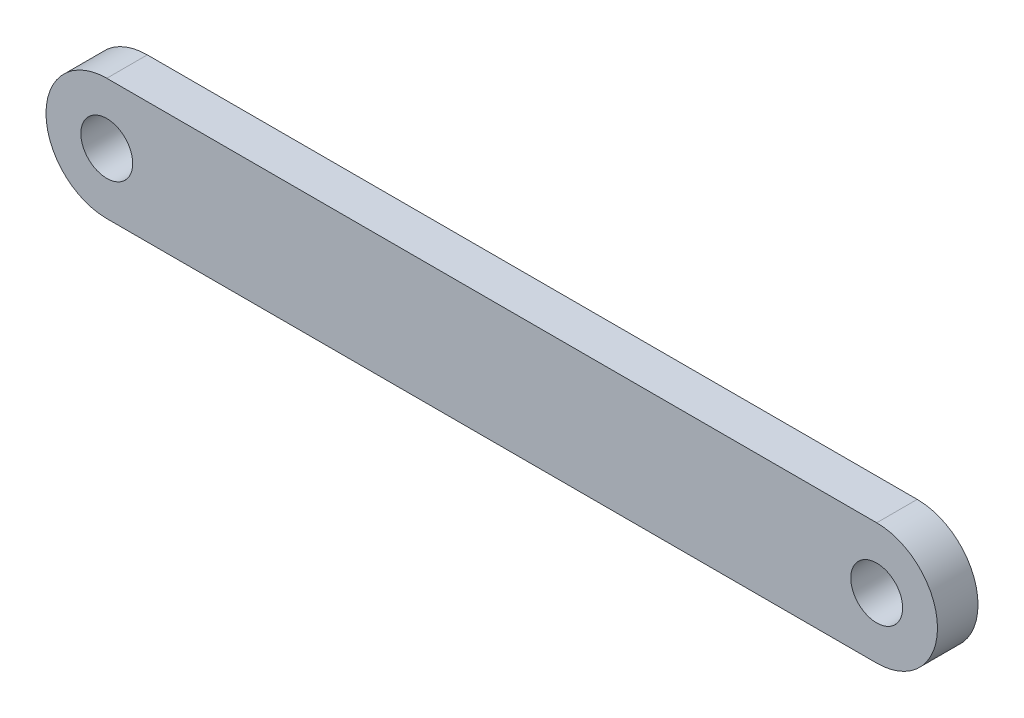
ISO-10303-21;
HEADER;
FILE_DESCRIPTION(('STEP AP214'),'2;1');
FILE_NAME('part.step','',(''),(''),'','','');
FILE_SCHEMA(('AUTOMOTIVE_DESIGN { 1 0 10303 214 1 1 1 1 }'));
ENDSEC;
DATA;
#1=APPLICATION_CONTEXT('core data for automotive mechanical design processes');
#2=APPLICATION_PROTOCOL_DEFINITION('international standard','automotive_design',2000,#1);
#3=PRODUCT_CONTEXT('',#1,'mechanical');
#4=PRODUCT('Part','Part','',(#3));
#5=PRODUCT_RELATED_PRODUCT_CATEGORY('part','',(#4));
#6=PRODUCT_DEFINITION_FORMATION('','',#4);
#7=PRODUCT_DEFINITION_CONTEXT('part definition',#1,'design');
#8=PRODUCT_DEFINITION('design','',#6,#7);
#9=PRODUCT_DEFINITION_SHAPE('','',#8);
#10=(LENGTH_UNIT() NAMED_UNIT(*) SI_UNIT(.MILLI.,.METRE.));
#11=(NAMED_UNIT(*) PLANE_ANGLE_UNIT() SI_UNIT($,.RADIAN.));
#12=(NAMED_UNIT(*) SI_UNIT($,.STERADIAN.) SOLID_ANGLE_UNIT());
#13=UNCERTAINTY_MEASURE_WITH_UNIT(LENGTH_MEASURE(1.E-05),#10,'distance_accuracy_value','');
#14=(GEOMETRIC_REPRESENTATION_CONTEXT(3) GLOBAL_UNCERTAINTY_ASSIGNED_CONTEXT((#13)) GLOBAL_UNIT_ASSIGNED_CONTEXT((#10,
#11,#12)) REPRESENTATION_CONTEXT('',''));
#15=CARTESIAN_POINT('',(0.,0.,0.));
#16=DIRECTION('',(0.,0.,1.));
#17=DIRECTION('',(1.,0.,0.));
#18=AXIS2_PLACEMENT_3D('',#15,#16,#17);
#19=CARTESIAN_POINT('',(0.,0.,3.175));
#20=DIRECTION('',(0.,0.,1.));
#21=DIRECTION('',(1.,0.,0.));
#22=AXIS2_PLACEMENT_3D('',#19,#20,#21);
#23=PLANE('',#22);
#24=CARTESIAN_POINT('',(0.,0.,3.175));
#25=DIRECTION('',(0.,0.,1.));
#26=DIRECTION('',(1.,0.,0.));
#27=AXIS2_PLACEMENT_3D('',#24,#25,#26);
#28=CIRCLE('',#27,2.032);
#29=CARTESIAN_POINT('',(2.032,0.,3.175));
#30=VERTEX_POINT('',#29);
#31=EDGE_CURVE('E131',#30,#30,#28,.T.);
#32=ORIENTED_EDGE('',*,*,#31,.F.);
#33=EDGE_LOOP('',(#32));
#34=FACE_BOUND('',#33,.T.);
#35=CARTESIAN_POINT('',(0.,0.,3.175));
#36=DIRECTION('',(0.,0.,1.));
#37=DIRECTION('',(1.,0.,0.));
#38=AXIS2_PLACEMENT_3D('',#35,#36,#37);
#39=CIRCLE('',#38,4.7625);
#40=CARTESIAN_POINT('',(0.,4.7625,3.175));
#41=VERTEX_POINT('',#40);
#42=CARTESIAN_POINT('',(0.,-4.7625,3.175));
#43=VERTEX_POINT('',#42);
#44=EDGE_CURVE('E110',#41,#43,#39,.T.);
#45=ORIENTED_EDGE('',*,*,#44,.T.);
#46=DIRECTION('',(1.,0.,0.));
#47=VECTOR('',#46,1.);
#48=CARTESIAN_POINT('',(0.,-4.7625,3.175));
#49=LINE('',#48,#47);
#50=CARTESIAN_POINT('',(60.325,-4.7625,3.175));
#51=VERTEX_POINT('',#50);
#52=EDGE_CURVE('E105',#43,#51,#49,.T.);
#53=ORIENTED_EDGE('',*,*,#52,.T.);
#54=CARTESIAN_POINT('',(60.325,0.,3.175));
#55=DIRECTION('',(0.,0.,1.));
#56=DIRECTION('',(1.,0.,0.));
#57=AXIS2_PLACEMENT_3D('',#54,#55,#56);
#58=CIRCLE('',#57,4.7625);
#59=CARTESIAN_POINT('',(60.325,4.7625,3.175));
#60=VERTEX_POINT('',#59);
#61=EDGE_CURVE('E108',#51,#60,#58,.T.);
#62=ORIENTED_EDGE('',*,*,#61,.T.);
#63=DIRECTION('',(-1.,0.,0.));
#64=VECTOR('',#63,1.);
#65=CARTESIAN_POINT('',(0.,4.7625,3.175));
#66=LINE('',#65,#64);
#67=EDGE_CURVE('E69',#60,#41,#66,.T.);
#68=ORIENTED_EDGE('',*,*,#67,.T.);
#69=EDGE_LOOP('',(#45,#53,#62,#68));
#70=FACE_BOUND('',#69,.T.);
#71=CARTESIAN_POINT('',(60.325,0.,3.175));
#72=DIRECTION('',(0.,0.,1.));
#73=DIRECTION('',(1.,0.,0.));
#74=AXIS2_PLACEMENT_3D('',#71,#72,#73);
#75=CIRCLE('',#74,2.03200000000001);
#76=CARTESIAN_POINT('',(62.357,0.,3.175));
#77=VERTEX_POINT('',#76);
#78=EDGE_CURVE('E154',#77,#77,#75,.T.);
#79=ORIENTED_EDGE('',*,*,#78,.F.);
#80=EDGE_LOOP('',(#79));
#81=FACE_BOUND('',#80,.T.);
#82=ADVANCED_FACE('F49',(#34,#70,#81),#23,.T.);
#83=CARTESIAN_POINT('',(0.,0.,0.));
#84=DIRECTION('',(0.,0.,1.));
#85=DIRECTION('',(1.,0.,0.));
#86=AXIS2_PLACEMENT_3D('',#83,#84,#85);
#87=PLANE('',#86);
#88=CARTESIAN_POINT('',(0.,0.,0.));
#89=DIRECTION('',(0.,0.,1.));
#90=DIRECTION('',(1.,0.,0.));
#91=AXIS2_PLACEMENT_3D('',#88,#89,#90);
#92=CIRCLE('',#91,4.7625);
#93=CARTESIAN_POINT('',(0.,4.7625,0.));
#94=VERTEX_POINT('',#93);
#95=CARTESIAN_POINT('',(0.,-4.7625,0.));
#96=VERTEX_POINT('',#95);
#97=EDGE_CURVE('E127',#94,#96,#92,.T.);
#98=ORIENTED_EDGE('',*,*,#97,.F.);
#99=DIRECTION('',(-1.,0.,0.));
#100=VECTOR('',#99,1.);
#101=CARTESIAN_POINT('',(0.,4.7625,0.));
#102=LINE('',#101,#100);
#103=CARTESIAN_POINT('',(60.325,4.7625,0.));
#104=VERTEX_POINT('',#103);
#105=EDGE_CURVE('E98',#104,#94,#102,.T.);
#106=ORIENTED_EDGE('',*,*,#105,.F.);
#107=CARTESIAN_POINT('',(60.325,0.,0.));
#108=DIRECTION('',(0.,0.,1.));
#109=DIRECTION('',(1.,0.,0.));
#110=AXIS2_PLACEMENT_3D('',#107,#108,#109);
#111=CIRCLE('',#110,4.7625);
#112=CARTESIAN_POINT('',(60.325,-4.7625,0.));
#113=VERTEX_POINT('',#112);
#114=EDGE_CURVE('E91',#113,#104,#111,.T.);
#115=ORIENTED_EDGE('',*,*,#114,.F.);
#116=DIRECTION('',(1.,0.,0.));
#117=VECTOR('',#116,1.);
#118=CARTESIAN_POINT('',(0.,-4.7625,0.));
#119=LINE('',#118,#117);
#120=EDGE_CURVE('E115',#96,#113,#119,.T.);
#121=ORIENTED_EDGE('',*,*,#120,.F.);
#122=EDGE_LOOP('',(#98,#106,#115,#121));
#123=FACE_BOUND('',#122,.T.);
#124=CARTESIAN_POINT('',(0.,0.,0.));
#125=DIRECTION('',(0.,0.,1.));
#126=DIRECTION('',(1.,0.,0.));
#127=AXIS2_PLACEMENT_3D('',#124,#125,#126);
#128=CIRCLE('',#127,2.032);
#129=CARTESIAN_POINT('',(2.032,0.,0.));
#130=VERTEX_POINT('',#129);
#131=EDGE_CURVE('E151',#130,#130,#128,.T.);
#132=ORIENTED_EDGE('',*,*,#131,.T.);
#133=EDGE_LOOP('',(#132));
#134=FACE_BOUND('',#133,.T.);
#135=CARTESIAN_POINT('',(60.325,0.,0.));
#136=DIRECTION('',(0.,0.,1.));
#137=DIRECTION('',(1.,0.,0.));
#138=AXIS2_PLACEMENT_3D('',#135,#136,#137);
#139=CIRCLE('',#138,2.03200000000001);
#140=CARTESIAN_POINT('',(62.357,0.,0.));
#141=VERTEX_POINT('',#140);
#142=EDGE_CURVE('E157',#141,#141,#139,.T.);
#143=ORIENTED_EDGE('',*,*,#142,.T.);
#144=EDGE_LOOP('',(#143));
#145=FACE_BOUND('',#144,.T.);
#146=ADVANCED_FACE('F144',(#123,#134,#145),#87,.F.);
#147=CARTESIAN_POINT('',(0.,0.,3.175));
#148=DIRECTION('',(0.,0.,-1.));
#149=DIRECTION('',(-1.,0.,0.));
#150=AXIS2_PLACEMENT_3D('',#147,#148,#149);
#151=CYLINDRICAL_SURFACE('',#150,4.7625);
#152=ORIENTED_EDGE('',*,*,#97,.T.);
#153=DIRECTION('',(0.,0.,-1.));
#154=VECTOR('',#153,1.);
#155=CARTESIAN_POINT('',(0.,-4.7625,3.175));
#156=LINE('',#155,#154);
#157=EDGE_CURVE('E11',#43,#96,#156,.T.);
#158=ORIENTED_EDGE('',*,*,#157,.F.);
#159=ORIENTED_EDGE('',*,*,#44,.F.);
#160=DIRECTION('',(0.,0.,-1.));
#161=VECTOR('',#160,1.);
#162=CARTESIAN_POINT('',(0.,4.7625,3.175));
#163=LINE('',#162,#161);
#164=EDGE_CURVE('E123',#41,#94,#163,.T.);
#165=ORIENTED_EDGE('',*,*,#164,.T.);
#166=EDGE_LOOP('',(#152,#158,#159,#165));
#167=FACE_BOUND('',#166,.T.);
#168=ADVANCED_FACE('F51',(#167),#151,.T.);
#169=CARTESIAN_POINT('',(0.,-4.7625,3.175));
#170=DIRECTION('',(0.,1.,0.));
#171=DIRECTION('',(0.,0.,1.));
#172=AXIS2_PLACEMENT_3D('',#169,#170,#171);
#173=PLANE('',#172);
#174=ORIENTED_EDGE('',*,*,#120,.T.);
#175=DIRECTION('',(0.,0.,-1.));
#176=VECTOR('',#175,1.);
#177=CARTESIAN_POINT('',(60.325,-4.7625,3.175));
#178=LINE('',#177,#176);
#179=EDGE_CURVE('E59',#51,#113,#178,.T.);
#180=ORIENTED_EDGE('',*,*,#179,.F.);
#181=ORIENTED_EDGE('',*,*,#52,.F.);
#182=ORIENTED_EDGE('',*,*,#157,.T.);
#183=EDGE_LOOP('',(#174,#180,#181,#182));
#184=FACE_BOUND('',#183,.T.);
#185=ADVANCED_FACE('F114',(#184),#173,.F.);
#186=CARTESIAN_POINT('',(60.325,0.,3.175));
#187=DIRECTION('',(0.,0.,-1.));
#188=DIRECTION('',(-1.,0.,0.));
#189=AXIS2_PLACEMENT_3D('',#186,#187,#188);
#190=CYLINDRICAL_SURFACE('',#189,4.7625);
#191=ORIENTED_EDGE('',*,*,#114,.T.);
#192=DIRECTION('',(0.,0.,-1.));
#193=VECTOR('',#192,1.);
#194=CARTESIAN_POINT('',(60.325,4.7625,3.175));
#195=LINE('',#194,#193);
#196=EDGE_CURVE('E117',#60,#104,#195,.T.);
#197=ORIENTED_EDGE('',*,*,#196,.F.);
#198=ORIENTED_EDGE('',*,*,#61,.F.);
#199=ORIENTED_EDGE('',*,*,#179,.T.);
#200=EDGE_LOOP('',(#191,#197,#198,#199));
#201=FACE_BOUND('',#200,.T.);
#202=ADVANCED_FACE('F118',(#201),#190,.T.);
#203=CARTESIAN_POINT('',(0.,4.7625,3.175));
#204=DIRECTION('',(0.,-1.,0.));
#205=DIRECTION('',(0.,0.,-1.));
#206=AXIS2_PLACEMENT_3D('',#203,#204,#205);
#207=PLANE('',#206);
#208=ORIENTED_EDGE('',*,*,#105,.T.);
#209=ORIENTED_EDGE('',*,*,#164,.F.);
#210=ORIENTED_EDGE('',*,*,#67,.F.);
#211=ORIENTED_EDGE('',*,*,#196,.T.);
#212=EDGE_LOOP('',(#208,#209,#210,#211));
#213=FACE_BOUND('',#212,.T.);
#214=ADVANCED_FACE('F141',(#213),#207,.F.);
#215=CARTESIAN_POINT('',(0.,0.,3.175));
#216=DIRECTION('',(0.,0.,-1.));
#217=DIRECTION('',(-1.,0.,0.));
#218=AXIS2_PLACEMENT_3D('',#215,#216,#217);
#219=CYLINDRICAL_SURFACE('',#218,2.032);
#220=ORIENTED_EDGE('',*,*,#31,.T.);
#221=EDGE_LOOP('',(#220));
#222=FACE_BOUND('',#221,.T.);
#223=ORIENTED_EDGE('',*,*,#131,.F.);
#224=EDGE_LOOP('',(#223));
#225=FACE_BOUND('',#224,.T.);
#226=ADVANCED_FACE('F175',(#222,#225),#219,.F.);
#227=CARTESIAN_POINT('',(60.325,0.,3.175));
#228=DIRECTION('',(0.,0.,-1.));
#229=DIRECTION('',(-1.,0.,0.));
#230=AXIS2_PLACEMENT_3D('',#227,#228,#229);
#231=CYLINDRICAL_SURFACE('',#230,2.03200000000001);
#232=ORIENTED_EDGE('',*,*,#78,.T.);
#233=EDGE_LOOP('',(#232));
#234=FACE_BOUND('',#233,.T.);
#235=ORIENTED_EDGE('',*,*,#142,.F.);
#236=EDGE_LOOP('',(#235));
#237=FACE_BOUND('',#236,.T.);
#238=ADVANCED_FACE('F164',(#234,#237),#231,.F.);
#239=CLOSED_SHELL('',(#82,#146,#168,#185,#202,#214,#226,#238));
#240=MANIFOLD_SOLID_BREP('B2',#239);
#241=ADVANCED_BREP_SHAPE_REPRESENTATION('',(#18,#240),#14);
#242=SHAPE_DEFINITION_REPRESENTATION(#9,#241);
ENDSEC;
END-ISO-10303-21;
